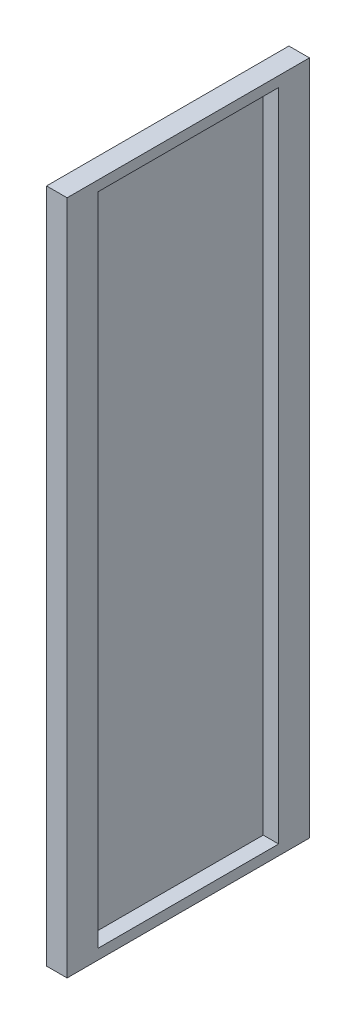
ISO-10303-21;
HEADER;
FILE_DESCRIPTION(('STEP AP214'),'2;1');
FILE_NAME('part.step','',(''),(''),'','','');
FILE_SCHEMA(('AUTOMOTIVE_DESIGN { 1 0 10303 214 1 1 1 1 }'));
ENDSEC;
DATA;
#1=APPLICATION_CONTEXT('core data for automotive mechanical design processes');
#2=APPLICATION_PROTOCOL_DEFINITION('international standard','automotive_design',2000,#1);
#3=PRODUCT_CONTEXT('',#1,'mechanical');
#4=PRODUCT('Part','Part','',(#3));
#5=PRODUCT_RELATED_PRODUCT_CATEGORY('part','',(#4));
#6=PRODUCT_DEFINITION_FORMATION('','',#4);
#7=PRODUCT_DEFINITION_CONTEXT('part definition',#1,'design');
#8=PRODUCT_DEFINITION('design','',#6,#7);
#9=PRODUCT_DEFINITION_SHAPE('','',#8);
#10=(LENGTH_UNIT() NAMED_UNIT(*) SI_UNIT(.MILLI.,.METRE.));
#11=(NAMED_UNIT(*) PLANE_ANGLE_UNIT() SI_UNIT($,.RADIAN.));
#12=(NAMED_UNIT(*) SI_UNIT($,.STERADIAN.) SOLID_ANGLE_UNIT());
#13=UNCERTAINTY_MEASURE_WITH_UNIT(LENGTH_MEASURE(1.E-05),#10,'distance_accuracy_value','');
#14=(GEOMETRIC_REPRESENTATION_CONTEXT(3) GLOBAL_UNCERTAINTY_ASSIGNED_CONTEXT((#13)) GLOBAL_UNIT_ASSIGNED_CONTEXT((#10,
#11,#12)) REPRESENTATION_CONTEXT('',''));
#15=CARTESIAN_POINT('',(0.,0.,0.));
#16=DIRECTION('',(0.,0.,1.));
#17=DIRECTION('',(1.,0.,0.));
#18=AXIS2_PLACEMENT_3D('',#15,#16,#17);
#19=CARTESIAN_POINT('',(-12.7,417.83,149.86));
#20=DIRECTION('',(1.,0.,0.));
#21=DIRECTION('',(0.,0.,-1.));
#22=AXIS2_PLACEMENT_3D('',#19,#20,#21);
#23=PLANE('',#22);
#24=DIRECTION('',(0.,0.,1.));
#25=VECTOR('',#24,1.);
#26=CARTESIAN_POINT('',(-12.7,172.72,-143.51));
#27=LINE('',#26,#25);
#28=CARTESIAN_POINT('',(-12.7,172.72,-143.51));
#29=VERTEX_POINT('',#28);
#30=CARTESIAN_POINT('',(-12.7,172.72,-118.11));
#31=VERTEX_POINT('',#30);
#32=EDGE_CURVE('E170',#29,#31,#27,.T.);
#33=ORIENTED_EDGE('',*,*,#32,.F.);
#34=DIRECTION('',(0.,-1.,0.));
#35=VECTOR('',#34,1.);
#36=CARTESIAN_POINT('',(-12.7,290.83,-143.51));
#37=LINE('',#36,#35);
#38=CARTESIAN_POINT('',(-12.7,290.83,-143.51));
#39=VERTEX_POINT('',#38);
#40=EDGE_CURVE('E60',#39,#29,#37,.T.);
#41=ORIENTED_EDGE('',*,*,#40,.F.);
#42=DIRECTION('',(0.,0.,-1.));
#43=VECTOR('',#42,1.);
#44=CARTESIAN_POINT('',(-12.7,290.83,-143.51));
#45=LINE('',#44,#43);
#46=CARTESIAN_POINT('',(-12.7,290.83,-118.11));
#47=VERTEX_POINT('',#46);
#48=EDGE_CURVE('E157',#47,#39,#45,.T.);
#49=ORIENTED_EDGE('',*,*,#48,.F.);
#50=DIRECTION('',(0.,1.,0.));
#51=VECTOR('',#50,1.);
#52=CARTESIAN_POINT('',(-12.7,290.83,-118.11));
#53=LINE('',#52,#51);
#54=EDGE_CURVE('E161',#31,#47,#53,.T.);
#55=ORIENTED_EDGE('',*,*,#54,.F.);
#56=EDGE_LOOP('',(#33,#41,#49,#55));
#57=FACE_BOUND('',#56,.T.);
#58=DIRECTION('',(0.,0.,1.));
#59=VECTOR('',#58,1.);
#60=CARTESIAN_POINT('',(-12.7,-417.83,149.86));
#61=LINE('',#60,#59);
#62=CARTESIAN_POINT('',(-12.7,-417.83,-149.86));
#63=VERTEX_POINT('',#62);
#64=CARTESIAN_POINT('',(-12.7,-417.83,149.86));
#65=VERTEX_POINT('',#64);
#66=EDGE_CURVE('E218',#63,#65,#61,.T.);
#67=ORIENTED_EDGE('',*,*,#66,.T.);
#68=DIRECTION('',(0.,-1.,0.));
#69=VECTOR('',#68,1.);
#70=CARTESIAN_POINT('',(-12.7,417.83,149.86));
#71=LINE('',#70,#69);
#72=CARTESIAN_POINT('',(-12.7,417.83,149.86));
#73=VERTEX_POINT('',#72);
#74=EDGE_CURVE('E11',#73,#65,#71,.T.);
#75=ORIENTED_EDGE('',*,*,#74,.F.);
#76=DIRECTION('',(0.,0.,1.));
#77=VECTOR('',#76,1.);
#78=CARTESIAN_POINT('',(-12.7,417.83,149.86));
#79=LINE('',#78,#77);
#80=CARTESIAN_POINT('',(-12.7,417.83,-149.86));
#81=VERTEX_POINT('',#80);
#82=EDGE_CURVE('E227',#81,#73,#79,.T.);
#83=ORIENTED_EDGE('',*,*,#82,.F.);
#84=DIRECTION('',(0.,-1.,0.));
#85=VECTOR('',#84,1.);
#86=CARTESIAN_POINT('',(-12.7,417.83,-149.86));
#87=LINE('',#86,#85);
#88=EDGE_CURVE('E241',#81,#63,#87,.T.);
#89=ORIENTED_EDGE('',*,*,#88,.T.);
#90=EDGE_LOOP('',(#67,#75,#83,#89));
#91=FACE_BOUND('',#90,.T.);
#92=ADVANCED_FACE('F45',(#57,#91),#23,.F.);
#93=CARTESIAN_POINT('',(12.7,417.83,149.86));
#94=DIRECTION('',(0.,0.,-1.));
#95=DIRECTION('',(-1.,0.,0.));
#96=AXIS2_PLACEMENT_3D('',#93,#94,#95);
#97=PLANE('',#96);
#98=DIRECTION('',(1.,0.,0.));
#99=VECTOR('',#98,1.);
#100=CARTESIAN_POINT('',(12.7,-417.83,149.86));
#101=LINE('',#100,#99);
#102=CARTESIAN_POINT('',(12.7,-417.83,149.86));
#103=VERTEX_POINT('',#102);
#104=EDGE_CURVE('E245',#65,#103,#101,.T.);
#105=ORIENTED_EDGE('',*,*,#104,.T.);
#106=DIRECTION('',(0.,-1.,0.));
#107=VECTOR('',#106,1.);
#108=CARTESIAN_POINT('',(12.7,417.83,149.86));
#109=LINE('',#108,#107);
#110=CARTESIAN_POINT('',(12.7,417.83,149.86));
#111=VERTEX_POINT('',#110);
#112=EDGE_CURVE('E53',#111,#103,#109,.T.);
#113=ORIENTED_EDGE('',*,*,#112,.F.);
#114=DIRECTION('',(1.,0.,0.));
#115=VECTOR('',#114,1.);
#116=CARTESIAN_POINT('',(12.7,417.83,149.86));
#117=LINE('',#116,#115);
#118=EDGE_CURVE('E231',#73,#111,#117,.T.);
#119=ORIENTED_EDGE('',*,*,#118,.F.);
#120=ORIENTED_EDGE('',*,*,#74,.T.);
#121=EDGE_LOOP('',(#105,#113,#119,#120));
#122=FACE_BOUND('',#121,.T.);
#123=ADVANCED_FACE('F281',(#122),#97,.F.);
#124=CARTESIAN_POINT('',(12.7,417.83,149.86));
#125=DIRECTION('',(-1.,0.,0.));
#126=DIRECTION('',(0.,0.,1.));
#127=AXIS2_PLACEMENT_3D('',#124,#125,#126);
#128=PLANE('',#127);
#129=DIRECTION('',(0.,0.,-1.));
#130=VECTOR('',#129,1.);
#131=CARTESIAN_POINT('',(12.7,-405.13,-111.76));
#132=LINE('',#131,#130);
#133=CARTESIAN_POINT('',(12.7,-405.13,111.76));
#134=VERTEX_POINT('',#133);
#135=CARTESIAN_POINT('',(12.7,-405.13,-111.76));
#136=VERTEX_POINT('',#135);
#137=EDGE_CURVE('E204',#134,#136,#132,.T.);
#138=ORIENTED_EDGE('',*,*,#137,.F.);
#139=DIRECTION('',(0.,-1.,0.));
#140=VECTOR('',#139,1.);
#141=CARTESIAN_POINT('',(12.7,-405.13,111.76));
#142=LINE('',#141,#140);
#143=CARTESIAN_POINT('',(12.7,405.13,111.76));
#144=VERTEX_POINT('',#143);
#145=EDGE_CURVE('E68',#144,#134,#142,.T.);
#146=ORIENTED_EDGE('',*,*,#145,.F.);
#147=DIRECTION('',(0.,0.,1.));
#148=VECTOR('',#147,1.);
#149=CARTESIAN_POINT('',(12.7,405.13,-111.76));
#150=LINE('',#149,#148);
#151=CARTESIAN_POINT('',(12.7,405.13,-111.76));
#152=VERTEX_POINT('',#151);
#153=EDGE_CURVE('E189',#152,#144,#150,.T.);
#154=ORIENTED_EDGE('',*,*,#153,.F.);
#155=DIRECTION('',(0.,1.,0.));
#156=VECTOR('',#155,1.);
#157=CARTESIAN_POINT('',(12.7,-405.13,-111.76));
#158=LINE('',#157,#156);
#159=EDGE_CURVE('E208',#136,#152,#158,.T.);
#160=ORIENTED_EDGE('',*,*,#159,.F.);
#161=EDGE_LOOP('',(#138,#146,#154,#160));
#162=FACE_BOUND('',#161,.T.);
#163=DIRECTION('',(0.,0.,-1.));
#164=VECTOR('',#163,1.);
#165=CARTESIAN_POINT('',(12.7,-417.83,149.86));
#166=LINE('',#165,#164);
#167=CARTESIAN_POINT('',(12.7,-417.83,-149.86));
#168=VERTEX_POINT('',#167);
#169=EDGE_CURVE('E248',#103,#168,#166,.T.);
#170=ORIENTED_EDGE('',*,*,#169,.T.);
#171=DIRECTION('',(0.,-1.,0.));
#172=VECTOR('',#171,1.);
#173=CARTESIAN_POINT('',(12.7,417.83,-149.86));
#174=LINE('',#173,#172);
#175=CARTESIAN_POINT('',(12.7,417.83,-149.86));
#176=VERTEX_POINT('',#175);
#177=EDGE_CURVE('E256',#176,#168,#174,.T.);
#178=ORIENTED_EDGE('',*,*,#177,.F.);
#179=DIRECTION('',(0.,0.,-1.));
#180=VECTOR('',#179,1.);
#181=CARTESIAN_POINT('',(12.7,417.83,149.86));
#182=LINE('',#181,#180);
#183=EDGE_CURVE('E235',#111,#176,#182,.T.);
#184=ORIENTED_EDGE('',*,*,#183,.F.);
#185=ORIENTED_EDGE('',*,*,#112,.T.);
#186=EDGE_LOOP('',(#170,#178,#184,#185));
#187=FACE_BOUND('',#186,.T.);
#188=ADVANCED_FACE('F265',(#162,#187),#128,.F.);
#189=CARTESIAN_POINT('',(12.7,417.83,-149.86));
#190=DIRECTION('',(0.,0.,1.));
#191=DIRECTION('',(1.,0.,0.));
#192=AXIS2_PLACEMENT_3D('',#189,#190,#191);
#193=PLANE('',#192);
#194=DIRECTION('',(-1.,0.,0.));
#195=VECTOR('',#194,1.);
#196=CARTESIAN_POINT('',(12.7,-417.83,-149.86));
#197=LINE('',#196,#195);
#198=EDGE_CURVE('E232',#168,#63,#197,.T.);
#199=ORIENTED_EDGE('',*,*,#198,.T.);
#200=ORIENTED_EDGE('',*,*,#88,.F.);
#201=DIRECTION('',(-1.,0.,0.));
#202=VECTOR('',#201,1.);
#203=CARTESIAN_POINT('',(12.7,417.83,-149.86));
#204=LINE('',#203,#202);
#205=EDGE_CURVE('E238',#176,#81,#204,.T.);
#206=ORIENTED_EDGE('',*,*,#205,.F.);
#207=ORIENTED_EDGE('',*,*,#177,.T.);
#208=EDGE_LOOP('',(#199,#200,#206,#207));
#209=FACE_BOUND('',#208,.T.);
#210=ADVANCED_FACE('F274',(#209),#193,.F.);
#211=CARTESIAN_POINT('',(0.,417.83,0.));
#212=DIRECTION('',(0.,1.,0.));
#213=DIRECTION('',(0.,0.,1.));
#214=AXIS2_PLACEMENT_3D('',#211,#212,#213);
#215=PLANE('',#214);
#216=ORIENTED_EDGE('',*,*,#82,.T.);
#217=ORIENTED_EDGE('',*,*,#118,.T.);
#218=ORIENTED_EDGE('',*,*,#183,.T.);
#219=ORIENTED_EDGE('',*,*,#205,.T.);
#220=EDGE_LOOP('',(#216,#217,#218,#219));
#221=FACE_BOUND('',#220,.T.);
#222=ADVANCED_FACE('F280',(#221),#215,.T.);
#223=CARTESIAN_POINT('',(0.,-417.83,0.));
#224=DIRECTION('',(0.,1.,0.));
#225=DIRECTION('',(0.,0.,1.));
#226=AXIS2_PLACEMENT_3D('',#223,#224,#225);
#227=PLANE('',#226);
#228=ORIENTED_EDGE('',*,*,#66,.F.);
#229=ORIENTED_EDGE('',*,*,#198,.F.);
#230=ORIENTED_EDGE('',*,*,#169,.F.);
#231=ORIENTED_EDGE('',*,*,#104,.F.);
#232=EDGE_LOOP('',(#228,#229,#230,#231));
#233=FACE_BOUND('',#232,.T.);
#234=ADVANCED_FACE('F271',(#233),#227,.F.);
#235=CARTESIAN_POINT('',(-6.35,-405.13,111.76));
#236=DIRECTION('',(0.,0.,1.));
#237=DIRECTION('',(1.,0.,0.));
#238=AXIS2_PLACEMENT_3D('',#235,#236,#237);
#239=PLANE('',#238);
#240=ORIENTED_EDGE('',*,*,#145,.T.);
#241=DIRECTION('',(1.,0.,0.));
#242=VECTOR('',#241,1.);
#243=CARTESIAN_POINT('',(-6.35,-405.13,111.76));
#244=LINE('',#243,#242);
#245=CARTESIAN_POINT('',(-6.35,-405.13,111.76));
#246=VERTEX_POINT('',#245);
#247=EDGE_CURVE('E201',#246,#134,#244,.T.);
#248=ORIENTED_EDGE('',*,*,#247,.F.);
#249=DIRECTION('',(0.,-1.,0.));
#250=VECTOR('',#249,1.);
#251=CARTESIAN_POINT('',(-6.35,-405.13,111.76));
#252=LINE('',#251,#250);
#253=CARTESIAN_POINT('',(-6.35,405.13,111.76));
#254=VERTEX_POINT('',#253);
#255=EDGE_CURVE('E184',#254,#246,#252,.T.);
#256=ORIENTED_EDGE('',*,*,#255,.F.);
#257=DIRECTION('',(1.,0.,0.));
#258=VECTOR('',#257,1.);
#259=CARTESIAN_POINT('',(-6.35,405.13,111.76));
#260=LINE('',#259,#258);
#261=EDGE_CURVE('E215',#254,#144,#260,.T.);
#262=ORIENTED_EDGE('',*,*,#261,.T.);
#263=EDGE_LOOP('',(#240,#248,#256,#262));
#264=FACE_BOUND('',#263,.T.);
#265=ADVANCED_FACE('F295',(#264),#239,.F.);
#266=CARTESIAN_POINT('',(-6.35,405.13,-111.76));
#267=DIRECTION('',(0.,1.,0.));
#268=DIRECTION('',(0.,0.,1.));
#269=AXIS2_PLACEMENT_3D('',#266,#267,#268);
#270=PLANE('',#269);
#271=ORIENTED_EDGE('',*,*,#153,.T.);
#272=ORIENTED_EDGE('',*,*,#261,.F.);
#273=DIRECTION('',(0.,0.,1.));
#274=VECTOR('',#273,1.);
#275=CARTESIAN_POINT('',(-6.35,405.13,-111.76));
#276=LINE('',#275,#274);
#277=CARTESIAN_POINT('',(-6.35,405.13,-111.76));
#278=VERTEX_POINT('',#277);
#279=EDGE_CURVE('E197',#278,#254,#276,.T.);
#280=ORIENTED_EDGE('',*,*,#279,.F.);
#281=DIRECTION('',(1.,0.,0.));
#282=VECTOR('',#281,1.);
#283=CARTESIAN_POINT('',(-6.35,405.13,-111.76));
#284=LINE('',#283,#282);
#285=EDGE_CURVE('E219',#278,#152,#284,.T.);
#286=ORIENTED_EDGE('',*,*,#285,.T.);
#287=EDGE_LOOP('',(#271,#272,#280,#286));
#288=FACE_BOUND('',#287,.T.);
#289=ADVANCED_FACE('F300',(#288),#270,.F.);
#290=CARTESIAN_POINT('',(-6.35,-405.13,-111.76));
#291=DIRECTION('',(0.,0.,-1.));
#292=DIRECTION('',(-1.,0.,0.));
#293=AXIS2_PLACEMENT_3D('',#290,#291,#292);
#294=PLANE('',#293);
#295=ORIENTED_EDGE('',*,*,#159,.T.);
#296=ORIENTED_EDGE('',*,*,#285,.F.);
#297=DIRECTION('',(0.,1.,0.));
#298=VECTOR('',#297,1.);
#299=CARTESIAN_POINT('',(-6.35,-405.13,-111.76));
#300=LINE('',#299,#298);
#301=CARTESIAN_POINT('',(-6.35,-405.13,-111.76));
#302=VERTEX_POINT('',#301);
#303=EDGE_CURVE('E193',#302,#278,#300,.T.);
#304=ORIENTED_EDGE('',*,*,#303,.F.);
#305=DIRECTION('',(1.,0.,0.));
#306=VECTOR('',#305,1.);
#307=CARTESIAN_POINT('',(-6.35,-405.13,-111.76));
#308=LINE('',#307,#306);
#309=EDGE_CURVE('E222',#302,#136,#308,.T.);
#310=ORIENTED_EDGE('',*,*,#309,.T.);
#311=EDGE_LOOP('',(#295,#296,#304,#310));
#312=FACE_BOUND('',#311,.T.);
#313=ADVANCED_FACE('F305',(#312),#294,.F.);
#314=CARTESIAN_POINT('',(-6.35,-405.13,-111.76));
#315=DIRECTION('',(0.,-1.,0.));
#316=DIRECTION('',(0.,0.,-1.));
#317=AXIS2_PLACEMENT_3D('',#314,#315,#316);
#318=PLANE('',#317);
#319=ORIENTED_EDGE('',*,*,#137,.T.);
#320=ORIENTED_EDGE('',*,*,#309,.F.);
#321=DIRECTION('',(0.,0.,-1.));
#322=VECTOR('',#321,1.);
#323=CARTESIAN_POINT('',(-6.35,-405.13,-111.76));
#324=LINE('',#323,#322);
#325=EDGE_CURVE('E188',#246,#302,#324,.T.);
#326=ORIENTED_EDGE('',*,*,#325,.F.);
#327=ORIENTED_EDGE('',*,*,#247,.T.);
#328=EDGE_LOOP('',(#319,#320,#326,#327));
#329=FACE_BOUND('',#328,.T.);
#330=ADVANCED_FACE('F301',(#329),#318,.F.);
#331=CARTESIAN_POINT('',(-6.35,0.,0.));
#332=DIRECTION('',(1.,0.,0.));
#333=DIRECTION('',(0.,0.,-1.));
#334=AXIS2_PLACEMENT_3D('',#331,#332,#333);
#335=PLANE('',#334);
#336=ORIENTED_EDGE('',*,*,#255,.T.);
#337=ORIENTED_EDGE('',*,*,#325,.T.);
#338=ORIENTED_EDGE('',*,*,#303,.T.);
#339=ORIENTED_EDGE('',*,*,#279,.T.);
#340=EDGE_LOOP('',(#336,#337,#338,#339));
#341=FACE_BOUND('',#340,.T.);
#342=ADVANCED_FACE('F304',(#341),#335,.T.);
#343=CARTESIAN_POINT('',(0.,290.83,-143.51));
#344=DIRECTION('',(0.,0.,-1.));
#345=DIRECTION('',(0.,1.,0.));
#346=AXIS2_PLACEMENT_3D('',#343,#344,#345);
#347=PLANE('',#346);
#348=ORIENTED_EDGE('',*,*,#40,.T.);
#349=DIRECTION('',(-1.,0.,0.));
#350=VECTOR('',#349,1.);
#351=CARTESIAN_POINT('',(0.,172.72,-143.51));
#352=LINE('',#351,#350);
#353=CARTESIAN_POINT('',(0.,172.72,-143.51));
#354=VERTEX_POINT('',#353);
#355=EDGE_CURVE('E132',#354,#29,#352,.T.);
#356=ORIENTED_EDGE('',*,*,#355,.F.);
#357=DIRECTION('',(0.,-1.,0.));
#358=VECTOR('',#357,1.);
#359=CARTESIAN_POINT('',(0.,290.83,-143.51));
#360=LINE('',#359,#358);
#361=CARTESIAN_POINT('',(0.,290.83,-143.51));
#362=VERTEX_POINT('',#361);
#363=EDGE_CURVE('E136',#362,#354,#360,.T.);
#364=ORIENTED_EDGE('',*,*,#363,.F.);
#365=DIRECTION('',(-1.,0.,0.));
#366=VECTOR('',#365,1.);
#367=CARTESIAN_POINT('',(0.,290.83,-143.51));
#368=LINE('',#367,#366);
#369=EDGE_CURVE('E176',#362,#39,#368,.T.);
#370=ORIENTED_EDGE('',*,*,#369,.T.);
#371=EDGE_LOOP('',(#348,#356,#364,#370));
#372=FACE_BOUND('',#371,.T.);
#373=ADVANCED_FACE('F134',(#372),#347,.F.);
#374=CARTESIAN_POINT('',(0.,290.83,-143.51));
#375=DIRECTION('',(0.,1.,0.));
#376=DIRECTION('',(0.,0.,1.));
#377=AXIS2_PLACEMENT_3D('',#374,#375,#376);
#378=PLANE('',#377);
#379=ORIENTED_EDGE('',*,*,#48,.T.);
#380=ORIENTED_EDGE('',*,*,#369,.F.);
#381=DIRECTION('',(0.,0.,-1.));
#382=VECTOR('',#381,1.);
#383=CARTESIAN_POINT('',(0.,290.83,-143.51));
#384=LINE('',#383,#382);
#385=CARTESIAN_POINT('',(0.,290.83,-118.11));
#386=VERTEX_POINT('',#385);
#387=EDGE_CURVE('E143',#386,#362,#384,.T.);
#388=ORIENTED_EDGE('',*,*,#387,.F.);
#389=DIRECTION('',(-1.,0.,0.));
#390=VECTOR('',#389,1.);
#391=CARTESIAN_POINT('',(0.,290.83,-118.11));
#392=LINE('',#391,#390);
#393=EDGE_CURVE('E179',#386,#47,#392,.T.);
#394=ORIENTED_EDGE('',*,*,#393,.T.);
#395=EDGE_LOOP('',(#379,#380,#388,#394));
#396=FACE_BOUND('',#395,.T.);
#397=ADVANCED_FACE('F318',(#396),#378,.F.);
#398=CARTESIAN_POINT('',(0.,290.83,-118.11));
#399=DIRECTION('',(0.,0.,1.));
#400=DIRECTION('',(0.,-1.,0.));
#401=AXIS2_PLACEMENT_3D('',#398,#399,#400);
#402=PLANE('',#401);
#403=ORIENTED_EDGE('',*,*,#54,.T.);
#404=ORIENTED_EDGE('',*,*,#393,.F.);
#405=DIRECTION('',(0.,1.,0.));
#406=VECTOR('',#405,1.);
#407=CARTESIAN_POINT('',(0.,290.83,-118.11));
#408=LINE('',#407,#406);
#409=CARTESIAN_POINT('',(0.,172.72,-118.11));
#410=VERTEX_POINT('',#409);
#411=EDGE_CURVE('E152',#410,#386,#408,.T.);
#412=ORIENTED_EDGE('',*,*,#411,.F.);
#413=DIRECTION('',(-1.,0.,0.));
#414=VECTOR('',#413,1.);
#415=CARTESIAN_POINT('',(0.,172.72,-118.11));
#416=LINE('',#415,#414);
#417=EDGE_CURVE('E142',#410,#31,#416,.T.);
#418=ORIENTED_EDGE('',*,*,#417,.T.);
#419=EDGE_LOOP('',(#403,#404,#412,#418));
#420=FACE_BOUND('',#419,.T.);
#421=ADVANCED_FACE('F321',(#420),#402,.F.);
#422=CARTESIAN_POINT('',(0.,172.72,-143.51));
#423=DIRECTION('',(0.,-1.,0.));
#424=DIRECTION('',(0.,0.,-1.));
#425=AXIS2_PLACEMENT_3D('',#422,#423,#424);
#426=PLANE('',#425);
#427=ORIENTED_EDGE('',*,*,#32,.T.);
#428=ORIENTED_EDGE('',*,*,#417,.F.);
#429=DIRECTION('',(0.,0.,1.));
#430=VECTOR('',#429,1.);
#431=CARTESIAN_POINT('',(0.,172.72,-143.51));
#432=LINE('',#431,#430);
#433=EDGE_CURVE('E146',#354,#410,#432,.T.);
#434=ORIENTED_EDGE('',*,*,#433,.F.);
#435=ORIENTED_EDGE('',*,*,#355,.T.);
#436=EDGE_LOOP('',(#427,#428,#434,#435));
#437=FACE_BOUND('',#436,.T.);
#438=ADVANCED_FACE('F147',(#437),#426,.F.);
#439=CARTESIAN_POINT('',(0.,0.,0.));
#440=DIRECTION('',(-1.,0.,0.));
#441=DIRECTION('',(0.,0.,1.));
#442=AXIS2_PLACEMENT_3D('',#439,#440,#441);
#443=PLANE('',#442);
#444=ORIENTED_EDGE('',*,*,#363,.T.);
#445=ORIENTED_EDGE('',*,*,#433,.T.);
#446=ORIENTED_EDGE('',*,*,#411,.T.);
#447=ORIENTED_EDGE('',*,*,#387,.T.);
#448=EDGE_LOOP('',(#444,#445,#446,#447));
#449=FACE_BOUND('',#448,.T.);
#450=ADVANCED_FACE('F154',(#449),#443,.T.);
#451=CLOSED_SHELL('',(#92,#123,#188,#210,#222,#234,#265,#289,#313,#330,#342,#373,#397,#421,#438,#450));
#452=MANIFOLD_SOLID_BREP('B2',#451);
#453=ADVANCED_BREP_SHAPE_REPRESENTATION('',(#18,#452),#14);
#454=SHAPE_DEFINITION_REPRESENTATION(#9,#453);
ENDSEC;
END-ISO-10303-21;
